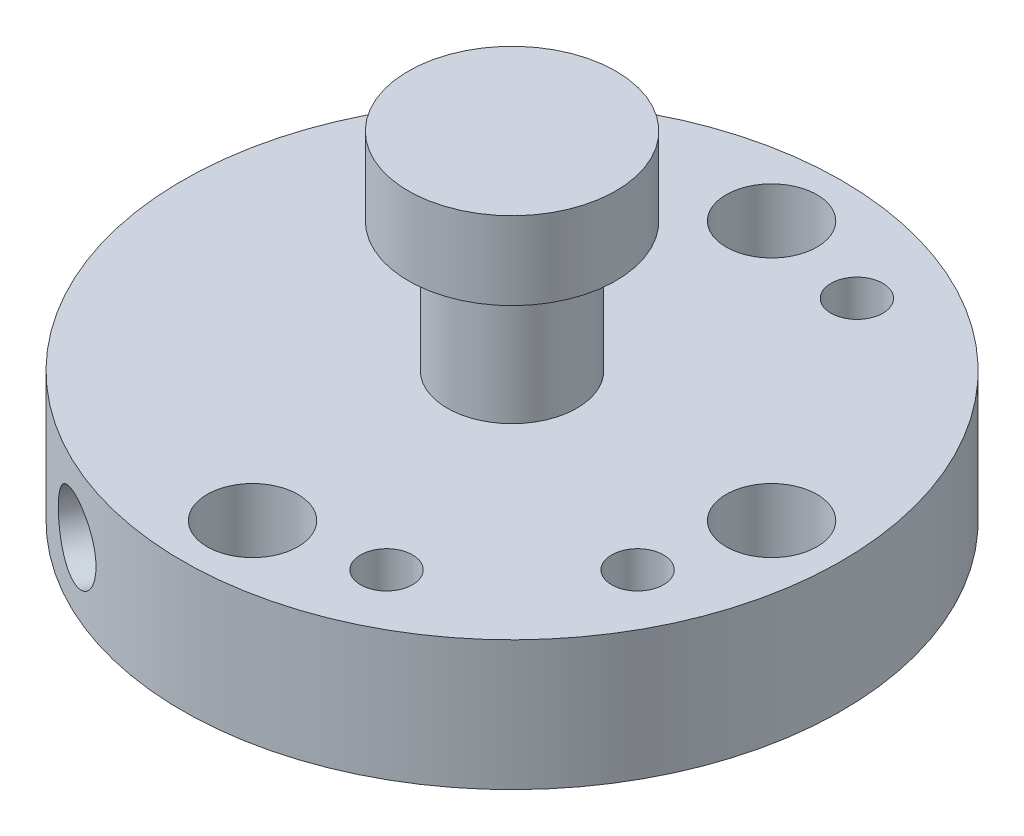
ISO-10303-21;
HEADER;
FILE_DESCRIPTION(('STEP AP214'),'2;1');
FILE_NAME('part.step','',(''),(''),'','','');
FILE_SCHEMA(('AUTOMOTIVE_DESIGN { 1 0 10303 214 1 1 1 1 }'));
ENDSEC;
DATA;
#1=APPLICATION_CONTEXT('core data for automotive mechanical design processes');
#2=APPLICATION_PROTOCOL_DEFINITION('international standard','automotive_design',2000,#1);
#3=PRODUCT_CONTEXT('',#1,'mechanical');
#4=PRODUCT('Part','Part','',(#3));
#5=PRODUCT_RELATED_PRODUCT_CATEGORY('part','',(#4));
#6=PRODUCT_DEFINITION_FORMATION('','',#4);
#7=PRODUCT_DEFINITION_CONTEXT('part definition',#1,'design');
#8=PRODUCT_DEFINITION('design','',#6,#7);
#9=PRODUCT_DEFINITION_SHAPE('','',#8);
#10=(LENGTH_UNIT() NAMED_UNIT(*) SI_UNIT(.MILLI.,.METRE.));
#11=(NAMED_UNIT(*) PLANE_ANGLE_UNIT() SI_UNIT($,.RADIAN.));
#12=(NAMED_UNIT(*) SI_UNIT($,.STERADIAN.) SOLID_ANGLE_UNIT());
#13=UNCERTAINTY_MEASURE_WITH_UNIT(LENGTH_MEASURE(1.E-05),#10,'distance_accuracy_value','');
#14=(GEOMETRIC_REPRESENTATION_CONTEXT(3) GLOBAL_UNCERTAINTY_ASSIGNED_CONTEXT((#13)) GLOBAL_UNIT_ASSIGNED_CONTEXT((#10,
#11,#12)) REPRESENTATION_CONTEXT('',''));
#15=CARTESIAN_POINT('',(0.,0.,0.));
#16=DIRECTION('',(0.,0.,1.));
#17=DIRECTION('',(1.,0.,0.));
#18=AXIS2_PLACEMENT_3D('',#15,#16,#17);
#19=CARTESIAN_POINT('',(0.,13.,0.));
#20=DIRECTION('',(0.,-1.,0.));
#21=DIRECTION('',(0.,0.,-1.));
#22=AXIS2_PLACEMENT_3D('',#19,#20,#21);
#23=PLANE('',#22);
#24=CARTESIAN_POINT('',(0.,13.,0.));
#25=DIRECTION('',(0.,-1.,0.));
#26=DIRECTION('',(0.,0.,-1.));
#27=AXIS2_PLACEMENT_3D('',#24,#25,#26);
#28=CIRCLE('',#27,4.);
#29=CARTESIAN_POINT('',(0.,13.,-4.));
#30=VERTEX_POINT('',#29);
#31=EDGE_CURVE('E20',#30,#30,#28,.T.);
#32=ORIENTED_EDGE('',*,*,#31,.F.);
#33=EDGE_LOOP('',(#32));
#34=FACE_BOUND('',#33,.T.);
#35=ADVANCED_FACE('F17',(#34),#23,.F.);
#36=CARTESIAN_POINT('',(0.,13.65,0.));
#37=DIRECTION('',(0.,-1.,0.));
#38=DIRECTION('',(0.,0.,-1.));
#39=AXIS2_PLACEMENT_3D('',#36,#37,#38);
#40=CYLINDRICAL_SURFACE('',#39,4.);
#41=ORIENTED_EDGE('',*,*,#31,.T.);
#42=EDGE_LOOP('',(#41));
#43=FACE_BOUND('',#42,.T.);
#44=CARTESIAN_POINT('',(0.,10.,0.));
#45=DIRECTION('',(0.,-1.,0.));
#46=DIRECTION('',(0.,0.,-1.));
#47=AXIS2_PLACEMENT_3D('',#44,#45,#46);
#48=CIRCLE('',#47,4.);
#49=CARTESIAN_POINT('',(0.,10.,-4.));
#50=VERTEX_POINT('',#49);
#51=EDGE_CURVE('E45',#50,#50,#48,.T.);
#52=ORIENTED_EDGE('',*,*,#51,.F.);
#53=EDGE_LOOP('',(#52));
#54=FACE_BOUND('',#53,.T.);
#55=ADVANCED_FACE('F163',(#43,#54),#40,.T.);
#56=CARTESIAN_POINT('',(0.,10.,0.));
#57=DIRECTION('',(0.,-1.,0.));
#58=DIRECTION('',(0.,0.,-1.));
#59=AXIS2_PLACEMENT_3D('',#56,#57,#58);
#60=PLANE('',#59);
#61=CARTESIAN_POINT('',(0.,10.,0.));
#62=DIRECTION('',(0.,-1.,0.));
#63=DIRECTION('',(0.,0.,-1.));
#64=AXIS2_PLACEMENT_3D('',#61,#62,#63);
#65=CIRCLE('',#64,2.5);
#66=CARTESIAN_POINT('',(0.,10.,-2.5));
#67=VERTEX_POINT('',#66);
#68=EDGE_CURVE('E39',#67,#67,#65,.T.);
#69=ORIENTED_EDGE('',*,*,#68,.F.);
#70=EDGE_LOOP('',(#69));
#71=FACE_BOUND('',#70,.T.);
#72=ORIENTED_EDGE('',*,*,#51,.T.);
#73=EDGE_LOOP('',(#72));
#74=FACE_BOUND('',#73,.T.);
#75=ADVANCED_FACE('F32',(#71,#74),#60,.T.);
#76=CARTESIAN_POINT('',(1.39464026375119,2.5,-2.99081569723573));
#77=DIRECTION('',(-0.422618261740681,0.,0.906307787036659));
#78=DIRECTION('',(0.906307787036659,0.,0.422618261740681));
#79=AXIS2_PLACEMENT_3D('',#76,#77,#78);
#80=CONICAL_SURFACE('',#79,1.49999999996027,1.02974425867617);
#81=CARTESIAN_POINT('',(1.77554226927218,2.5,-3.80766268411152));
#82=VERTEX_POINT('',#81);
#83=VERTEX_LOOP('',#82);
#84=FACE_BOUND('',#83,.T.);
#85=CARTESIAN_POINT('',(1.39464026374445,2.5,-2.99081569722086));
#86=DIRECTION('',(-0.422618261740681,0.,0.906307787036659));
#87=DIRECTION('',(0.906307787036659,0.,0.422618261740681));
#88=AXIS2_PLACEMENT_3D('',#85,#86,#87);
#89=CIRCLE('',#88,1.5);
#90=CARTESIAN_POINT('',(2.75410194429944,2.5,-2.35688830460984));
#91=VERTEX_POINT('',#90);
#92=EDGE_CURVE('E36',#91,#91,#89,.T.);
#93=ORIENTED_EDGE('',*,*,#92,.T.);
#94=EDGE_LOOP('',(#93));
#95=FACE_BOUND('',#94,.T.);
#96=ADVANCED_FACE('F28',(#84,#95),#80,.F.);
#97=CARTESIAN_POINT('',(0.,13.65,0.));
#98=DIRECTION('',(0.,-1.,0.));
#99=DIRECTION('',(0.,0.,-1.));
#100=AXIS2_PLACEMENT_3D('',#97,#98,#99);
#101=CYLINDRICAL_SURFACE('',#100,2.5);
#102=CARTESIAN_POINT('',(0.,5.,0.));
#103=DIRECTION('',(0.,-1.,0.));
#104=DIRECTION('',(0.,0.,-1.));
#105=AXIS2_PLACEMENT_3D('',#102,#103,#104);
#106=CIRCLE('',#105,2.5);
#107=CARTESIAN_POINT('',(0.,5.,-2.5));
#108=VERTEX_POINT('',#107);
#109=EDGE_CURVE('E38',#108,#108,#106,.F.);
#110=ORIENTED_EDGE('',*,*,#109,.T.);
#111=EDGE_LOOP('',(#110));
#112=FACE_BOUND('',#111,.T.);
#113=ORIENTED_EDGE('',*,*,#68,.T.);
#114=EDGE_LOOP('',(#113));
#115=FACE_BOUND('',#114,.T.);
#116=ADVANCED_FACE('F31',(#112,#115),#101,.T.);
#117=CARTESIAN_POINT('',(2.132681978957,2.5,-4.573551263119));
#118=DIRECTION('',(-0.422618261740681,0.,0.906307787036659));
#119=DIRECTION('',(0.906307787036659,0.,0.422618261740681));
#120=AXIS2_PLACEMENT_3D('',#117,#118,#119);
#121=CYLINDRICAL_SURFACE('',#120,1.5);
#122=ORIENTED_EDGE('',*,*,#92,.F.);
#123=EDGE_LOOP('',(#122));
#124=FACE_BOUND('',#123,.T.);
#125=CARTESIAN_POINT('',(-3.97022210722469,2.5,12.0634711596333));
#126=CARTESIAN_POINT('',(-3.97022591410956,2.41613626171538,12.0634706353555));
#127=CARTESIAN_POINT('',(-3.97698039922449,2.33216226442858,12.0612534087676));
#128=CARTESIAN_POINT('',(-4.00380477802316,2.16649075437455,12.0523748545496));
#129=CARTESIAN_POINT('',(-4.02390245169029,2.08479836236816,12.0457042550141));
#130=CARTESIAN_POINT('',(-4.07672904658194,1.92619883349531,12.0279279873252));
#131=CARTESIAN_POINT('',(-4.10944472146704,1.84928677624004,12.0168269697876));
#132=CARTESIAN_POINT('',(-4.18641841288593,1.70235359565551,11.9902273031278));
#133=CARTESIAN_POINT('',(-4.23067156532883,1.63232958548479,11.9747305069825));
#134=CARTESIAN_POINT('',(-4.32954524411073,1.50076350006435,11.9393383262271));
#135=CARTESIAN_POINT('',(-4.3842122156284,1.43926164100603,11.9194231677749));
#136=CARTESIAN_POINT('',(-4.50207932748534,1.32683140496281,11.8754044764067));
#137=CARTESIAN_POINT('',(-4.5652803034452,1.27590406463949,11.8513005332728));
#138=CARTESIAN_POINT('',(-4.69847461929875,1.18593318640807,11.7991295839346));
#139=CARTESIAN_POINT('',(-4.7684872840499,1.14692484038611,11.7710511932348));
#140=CARTESIAN_POINT('',(-4.9130221056574,1.08212507539745,11.7114609368353));
#141=CARTESIAN_POINT('',(-4.98754407279462,1.05633310081229,11.6799492155408));
#142=CARTESIAN_POINT('',(-5.13850945481263,1.01881471539259,11.614321327587));
#143=CARTESIAN_POINT('',(-5.21494225083705,1.00702307286824,11.5802180335715));
#144=CARTESIAN_POINT('',(-5.3678243553001,0.997638016082378,11.5101490263126));
#145=CARTESIAN_POINT('',(-5.44427366309744,1.00004412465891,11.4741833757));
#146=CARTESIAN_POINT('',(-5.5946285608187,1.0189337524339,11.4016256337488));
#147=CARTESIAN_POINT('',(-5.66854493674589,1.03534699357816,11.3650375619318));
#148=CARTESIAN_POINT('',(-5.81221466677056,1.08167548144747,11.2922385083987));
#149=CARTESIAN_POINT('',(-5.88196791192942,1.11159108131998,11.256027536571));
#150=CARTESIAN_POINT('',(-6.01564365365468,1.1841516870048,11.1851586865446));
#151=CARTESIAN_POINT('',(-6.07955142782724,1.22682773773099,11.150504835931));
#152=CARTESIAN_POINT('',(-6.19972307425843,1.32367153677186,11.0841397015269));
#153=CARTESIAN_POINT('',(-6.25598725543186,1.37783882044311,11.0524282988343));
#154=CARTESIAN_POINT('',(-6.3598046692036,1.49651067725114,10.9930200824681));
#155=CARTESIAN_POINT('',(-6.40730441457553,1.56107449350621,10.9653481215106));
#156=CARTESIAN_POINT('',(-6.49204082522322,1.69854109217163,10.9153943794378));
#157=CARTESIAN_POINT('',(-6.52927276941881,1.77144768882143,10.8931150784127));
#158=CARTESIAN_POINT('',(-6.59257420190124,1.92359982498908,10.8549223520492));
#159=CARTESIAN_POINT('',(-6.61863058036778,2.00285268059935,10.8390164045875));
#160=CARTESIAN_POINT('',(-6.65883529548752,2.16526948335083,10.8143643931199));
#161=CARTESIAN_POINT('',(-6.67300886854352,2.24842474373017,10.8056031564438));
#162=CARTESIAN_POINT('',(-6.6837755978639,2.36012111795231,10.7989419948239));
#163=CARTESIAN_POINT('',(-6.68578794235464,2.38804103788247,10.7976961514461));
#164=CARTESIAN_POINT('',(-6.68847335373301,2.44396986869392,10.7960329101938));
#165=CARTESIAN_POINT('',(-6.68914642014448,2.47197877960685,10.7956155126138));
#166=CARTESIAN_POINT('',(-6.68914261969618,2.58386373828462,10.7956189536551));
#167=CARTESIAN_POINT('',(-6.68310242624766,2.66783773557142,10.7993679836649));
#168=CARTESIAN_POINT('',(-6.65905868079672,2.83350924562545,10.8142096253405));
#169=CARTESIAN_POINT('',(-6.64103016947354,2.91520163763185,10.8253175578422));
#170=CARTESIAN_POINT('',(-6.59345647773279,3.07380116650469,10.854358712691));
#171=CARTESIAN_POINT('',(-6.56392337447644,3.15071322375996,10.8722847771115));
#172=CARTESIAN_POINT('',(-6.49406911252701,3.2976464043445,10.9141521095386));
#173=CARTESIAN_POINT('',(-6.45375249987384,3.36767041451521,10.9380908425059));
#174=CARTESIAN_POINT('',(-6.36308574083119,3.49923649993566,10.9910828194381));
#175=CARTESIAN_POINT('',(-6.31269059241439,3.56073835899398,11.0201589320934));
#176=CARTESIAN_POINT('',(-6.20320679940721,3.6731685950372,11.0821557087517));
#177=CARTESIAN_POINT('',(-6.14411730344512,3.72409593536051,11.1150767491944));
#178=CARTESIAN_POINT('',(-6.01853638170102,3.81406681359193,11.1835746748889));
#179=CARTESIAN_POINT('',(-5.95202381311057,3.85307515961389,11.2191590460277));
#180=CARTESIAN_POINT('',(-5.81346983583411,3.91787492460256,11.2915752644856));
#181=CARTESIAN_POINT('',(-5.7414286597181,3.94366689918771,11.3284070592934));
#182=CARTESIAN_POINT('',(-5.59411610378464,3.98118528460741,11.401868458065));
#183=CARTESIAN_POINT('',(-5.51886141065385,3.99297692713176,11.4384982018889));
#184=CARTESIAN_POINT('',(-5.36691471451665,4.00236198391762,11.5105731987761));
#185=CARTESIAN_POINT('',(-5.29022275990047,3.99995587534109,11.5460184916065));
#186=CARTESIAN_POINT('',(-5.13799403956259,3.9810662475661,11.6145578079885));
#187=CARTESIAN_POINT('',(-5.06245341986374,3.96465300642184,11.6476626777966));
#188=CARTESIAN_POINT('',(-4.91433698709356,3.91832451855253,11.7109257465185));
#189=CARTESIAN_POINT('',(-4.84176125162144,3.88840891868002,11.7410838683364));
#190=CARTESIAN_POINT('',(-4.70154745237186,3.8158483129952,11.7979318087551));
#191=CARTESIAN_POINT('',(-4.63392193727582,3.773172262269,11.8246129382297));
#192=CARTESIAN_POINT('',(-4.50583844948713,3.67632846322813,11.8740110740887));
#193=CARTESIAN_POINT('',(-4.4453801871435,3.62216117955689,11.8967282406866));
#194=CARTESIAN_POINT('',(-4.33313830587843,3.50348932274886,11.9380701282117));
#195=CARTESIAN_POINT('',(-4.28140810616835,3.43892550649379,11.9566698505642));
#196=CARTESIAN_POINT('',(-4.18867380478685,3.30145890782837,11.9894720606088));
#197=CARTESIAN_POINT('',(-4.14767463762655,3.22855231117857,12.003672525915));
#198=CARTESIAN_POINT('',(-4.07772793535311,3.07640017501091,12.027614425223));
#199=CARTESIAN_POINT('',(-4.04879455545592,2.99714731940065,12.0373506232064));
#200=CARTESIAN_POINT('',(-4.00406692632952,2.83473051664916,12.0523032142858));
#201=CARTESIAN_POINT('',(-3.98824483251358,2.75157525626982,12.0575291867836));
#202=CARTESIAN_POINT('',(-3.9762213664659,2.63987888204769,12.0614952677946));
#203=CARTESIAN_POINT('',(-3.97397348496426,2.61195896211753,12.0622360004225));
#204=CARTESIAN_POINT('',(-3.97097321908445,2.55603013130608,12.0632240340175));
#205=CARTESIAN_POINT('',(-3.97022083523798,2.52802122039315,12.0634713348092));
#206=CARTESIAN_POINT('',(-3.97022210722469,2.5,12.0634711596333));
#207=B_SPLINE_CURVE_WITH_KNOTS('',3,(#125,#126,#127,#128,#129,#130,#131,#132,#133,#134,#135,
#136,#137,#138,#139,#140,#141,#142,#143,#144,#145,#146,#147,#148,#149,#150,#151,#152,#153,#154,
#155,#156,#157,#158,#159,#160,#161,#162,#163,#164,#165,#166,#167,#168,#169,#170,#171,#172,#173,
#174,#175,#176,#177,#178,#179,#180,#181,#182,#183,#184,#185,#186,#187,#188,#189,#190,#191,#192,
#193,#194,#195,#196,#197,#198,#199,#200,#201,#202,#203,#204,#205,#206),.UNSPECIFIED.,.T.,.F.,(4,
2,2,2,2,2,2,2,2,2,2,2,2,2,2,2,2,2,2,2,2,2,2,2,2,2,2,2,2,2,2,2,2,2,2,2,2,2,2,2,4),(0.,
0.25148443810846,0.503494105525988,0.755239930912408,1.00687979379422,1.25966941096847,
1.51248379841286,1.76603758593995,2.01958071314891,2.271937813184,2.52428643198017,
2.77537633469056,3.02647280491301,3.2781852085814,3.52988743629811,3.78307830654183,
4.03638539923388,4.28998883375518,4.54305229742212,4.62708025162975,4.71110823571232,
4.96259267382079,5.21460234123832,5.46634816662474,5.71798802950654,5.97077764668079,
6.22359203412519,6.47714582165228,6.73068894886124,6.98304604889632,7.2353946676925,
7.48648457040289,7.73758104062534,7.98929344429372,8.24099567201043,8.49418654225415,
8.74749363494621,9.00109706946751,9.25416053313445,9.33818848734207,9.42221647142464),.UNSPECIFIED.);
#208=CARTESIAN_POINT('',(-3.97022210722469,2.5,12.0634711596333));
#209=VERTEX_POINT('',#208);
#210=EDGE_CURVE('E83',#209,#209,#207,.T.);
#211=ORIENTED_EDGE('',*,*,#210,.F.);
#212=EDGE_LOOP('',(#211));
#213=FACE_BOUND('',#212,.T.);
#214=ADVANCED_FACE('F90',(#124,#213),#121,.F.);
#215=CARTESIAN_POINT('',(0.,5.,0.));
#216=DIRECTION('',(0.,-1.,0.));
#217=DIRECTION('',(0.,0.,-1.));
#218=AXIS2_PLACEMENT_3D('',#215,#216,#217);
#219=PLANE('',#218);
#220=CARTESIAN_POINT('',(4.226182617407,5.,9.063077870366));
#221=DIRECTION('',(0.,1.,0.));
#222=DIRECTION('',(0.,0.,1.));
#223=AXIS2_PLACEMENT_3D('',#220,#221,#222);
#224=CIRCLE('',#223,1.);
#225=CARTESIAN_POINT('',(4.226182617407,5.,10.063077870366));
#226=VERTEX_POINT('',#225);
#227=EDGE_CURVE('E65',#226,#226,#224,.F.);
#228=ORIENTED_EDGE('',*,*,#227,.T.);
#229=EDGE_LOOP('',(#228));
#230=FACE_BOUND('',#229,.T.);
#231=CARTESIAN_POINT('',(9.063077870366,5.,4.226182617407));
#232=DIRECTION('',(0.,1.,0.));
#233=DIRECTION('',(0.,0.,1.));
#234=AXIS2_PLACEMENT_3D('',#231,#232,#233);
#235=CIRCLE('',#234,1.);
#236=CARTESIAN_POINT('',(9.063077870366,5.,5.226182617407));
#237=VERTEX_POINT('',#236);
#238=EDGE_CURVE('E68',#237,#237,#235,.F.);
#239=ORIENTED_EDGE('',*,*,#238,.T.);
#240=EDGE_LOOP('',(#239));
#241=FACE_BOUND('',#240,.T.);
#242=CARTESIAN_POINT('',(4.226182617407,5.,-9.063077870366));
#243=DIRECTION('',(0.,1.,0.));
#244=DIRECTION('',(0.,0.,1.));
#245=AXIS2_PLACEMENT_3D('',#242,#243,#244);
#246=CIRCLE('',#245,1.);
#247=CARTESIAN_POINT('',(4.226182617407,5.,-8.063077870366));
#248=VERTEX_POINT('',#247);
#249=EDGE_CURVE('E71',#248,#248,#246,.F.);
#250=ORIENTED_EDGE('',*,*,#249,.T.);
#251=EDGE_LOOP('',(#250));
#252=FACE_BOUND('',#251,.T.);
#253=CARTESIAN_POINT('',(-1.704987119415E-13,5.,10.));
#254=DIRECTION('',(0.,1.,0.));
#255=DIRECTION('',(0.,0.,1.));
#256=AXIS2_PLACEMENT_3D('',#253,#254,#255);
#257=CIRCLE('',#256,1.75);
#258=CARTESIAN_POINT('',(-1.704987119415E-13,5.,11.75));
#259=VERTEX_POINT('',#258);
#260=EDGE_CURVE('E74',#259,#259,#257,.F.);
#261=ORIENTED_EDGE('',*,*,#260,.T.);
#262=EDGE_LOOP('',(#261));
#263=FACE_BOUND('',#262,.T.);
#264=CARTESIAN_POINT('',(10.,5.,1.056926129637E-13));
#265=DIRECTION('',(0.,1.,0.));
#266=DIRECTION('',(0.,0.,1.));
#267=AXIS2_PLACEMENT_3D('',#264,#265,#266);
#268=CIRCLE('',#267,1.75);
#269=CARTESIAN_POINT('',(10.,5.,1.75000000000011));
#270=VERTEX_POINT('',#269);
#271=EDGE_CURVE('E77',#270,#270,#268,.F.);
#272=ORIENTED_EDGE('',*,*,#271,.T.);
#273=EDGE_LOOP('',(#272));
#274=FACE_BOUND('',#273,.T.);
#275=CARTESIAN_POINT('',(0.,5.,-10.));
#276=DIRECTION('',(0.,1.,0.));
#277=DIRECTION('',(0.,0.,1.));
#278=AXIS2_PLACEMENT_3D('',#275,#276,#277);
#279=CIRCLE('',#278,1.75);
#280=CARTESIAN_POINT('',(0.,5.,-8.25));
#281=VERTEX_POINT('',#280);
#282=EDGE_CURVE('E80',#281,#281,#279,.F.);
#283=ORIENTED_EDGE('',*,*,#282,.T.);
#284=EDGE_LOOP('',(#283));
#285=FACE_BOUND('',#284,.T.);
#286=ORIENTED_EDGE('',*,*,#109,.F.);
#287=EDGE_LOOP('',(#286));
#288=FACE_BOUND('',#287,.T.);
#289=CARTESIAN_POINT('',(0.,5.,0.));
#290=DIRECTION('',(0.,-1.,0.));
#291=DIRECTION('',(0.,0.,-1.));
#292=AXIS2_PLACEMENT_3D('',#289,#290,#291);
#293=CIRCLE('',#292,12.7);
#294=CARTESIAN_POINT('',(0.,5.,-12.7));
#295=VERTEX_POINT('',#294);
#296=EDGE_CURVE('E42',#295,#295,#293,.T.);
#297=ORIENTED_EDGE('',*,*,#296,.F.);
#298=EDGE_LOOP('',(#297));
#299=FACE_BOUND('',#298,.T.);
#300=ADVANCED_FACE('F99',(#230,#241,#252,#263,#274,#285,#288,#299),#219,.F.);
#301=CARTESIAN_POINT('',(0.,13.65,0.));
#302=DIRECTION('',(0.,-1.,0.));
#303=DIRECTION('',(0.,0.,-1.));
#304=AXIS2_PLACEMENT_3D('',#301,#302,#303);
#305=CYLINDRICAL_SURFACE('',#304,12.7);
#306=ORIENTED_EDGE('',*,*,#296,.T.);
#307=EDGE_LOOP('',(#306));
#308=FACE_BOUND('',#307,.T.);
#309=ORIENTED_EDGE('',*,*,#210,.T.);
#310=EDGE_LOOP('',(#309));
#311=FACE_BOUND('',#310,.T.);
#312=CARTESIAN_POINT('',(0.,-2.0643209364124E-13,0.));
#313=DIRECTION('',(0.,-1.,0.));
#314=DIRECTION('',(0.,0.,-1.));
#315=AXIS2_PLACEMENT_3D('',#312,#313,#314);
#316=CIRCLE('',#315,12.7);
#317=CARTESIAN_POINT('',(0.,-2.0643209364124E-13,-12.7));
#318=VERTEX_POINT('',#317);
#319=EDGE_CURVE('E62',#318,#318,#316,.T.);
#320=ORIENTED_EDGE('',*,*,#319,.F.);
#321=EDGE_LOOP('',(#320));
#322=FACE_BOUND('',#321,.T.);
#323=ADVANCED_FACE('F94',(#308,#311,#322),#305,.T.);
#324=CARTESIAN_POINT('',(0.,5.,-10.));
#325=DIRECTION('',(0.,1.,0.));
#326=DIRECTION('',(0.,0.,1.));
#327=AXIS2_PLACEMENT_3D('',#324,#325,#326);
#328=CYLINDRICAL_SURFACE('',#327,1.75);
#329=CARTESIAN_POINT('',(0.,-1.04083408558608E-13,-10.));
#330=DIRECTION('',(0.,1.,0.));
#331=DIRECTION('',(0.,0.,1.));
#332=AXIS2_PLACEMENT_3D('',#329,#330,#331);
#333=CIRCLE('',#332,1.75);
#334=CARTESIAN_POINT('',(0.,-1.04083408558608E-13,-8.25));
#335=VERTEX_POINT('',#334);
#336=EDGE_CURVE('E59',#335,#335,#333,.T.);
#337=ORIENTED_EDGE('',*,*,#336,.F.);
#338=EDGE_LOOP('',(#337));
#339=FACE_BOUND('',#338,.T.);
#340=ORIENTED_EDGE('',*,*,#282,.F.);
#341=EDGE_LOOP('',(#340));
#342=FACE_BOUND('',#341,.T.);
#343=ADVANCED_FACE('F98',(#339,#342),#328,.F.);
#344=CARTESIAN_POINT('',(10.,5.,1.056926129637E-13));
#345=DIRECTION('',(0.,1.,0.));
#346=DIRECTION('',(0.,0.,1.));
#347=AXIS2_PLACEMENT_3D('',#344,#345,#346);
#348=CYLINDRICAL_SURFACE('',#347,1.75);
#349=CARTESIAN_POINT('',(10.,-2.00360561475321E-13,1.056926129637E-13));
#350=DIRECTION('',(0.,1.,0.));
#351=DIRECTION('',(0.,0.,1.));
#352=AXIS2_PLACEMENT_3D('',#349,#350,#351);
#353=CIRCLE('',#352,1.75);
#354=CARTESIAN_POINT('',(10.,-2.00360561475321E-13,1.75000000000011));
#355=VERTEX_POINT('',#354);
#356=EDGE_CURVE('E56',#355,#355,#353,.T.);
#357=ORIENTED_EDGE('',*,*,#356,.F.);
#358=EDGE_LOOP('',(#357));
#359=FACE_BOUND('',#358,.T.);
#360=ORIENTED_EDGE('',*,*,#271,.F.);
#361=EDGE_LOOP('',(#360));
#362=FACE_BOUND('',#361,.T.);
#363=ADVANCED_FACE('F131',(#359,#362),#348,.F.);
#364=CARTESIAN_POINT('',(-1.704987119415E-13,5.,10.));
#365=DIRECTION('',(0.,1.,0.));
#366=DIRECTION('',(0.,0.,1.));
#367=AXIS2_PLACEMENT_3D('',#364,#365,#366);
#368=CYLINDRICAL_SURFACE('',#367,1.75);
#369=CARTESIAN_POINT('',(-1.704987119415E-13,-1.04083408558608E-13,10.));
#370=DIRECTION('',(0.,1.,0.));
#371=DIRECTION('',(0.,0.,1.));
#372=AXIS2_PLACEMENT_3D('',#369,#370,#371);
#373=CIRCLE('',#372,1.75);
#374=CARTESIAN_POINT('',(-1.704987119415E-13,-1.04083408558608E-13,11.75));
#375=VERTEX_POINT('',#374);
#376=EDGE_CURVE('E53',#375,#375,#373,.T.);
#377=ORIENTED_EDGE('',*,*,#376,.F.);
#378=EDGE_LOOP('',(#377));
#379=FACE_BOUND('',#378,.T.);
#380=ORIENTED_EDGE('',*,*,#260,.F.);
#381=EDGE_LOOP('',(#380));
#382=FACE_BOUND('',#381,.T.);
#383=ADVANCED_FACE('F128',(#379,#382),#368,.F.);
#384=CARTESIAN_POINT('',(4.226182617407,5.,-9.063077870366));
#385=DIRECTION('',(0.,1.,0.));
#386=DIRECTION('',(0.,0.,1.));
#387=AXIS2_PLACEMENT_3D('',#384,#385,#386);
#388=CYLINDRICAL_SURFACE('',#387,1.);
#389=CARTESIAN_POINT('',(4.226182617407,-1.38777878078145E-13,-9.063077870366));
#390=DIRECTION('',(0.,1.,0.));
#391=DIRECTION('',(0.,0.,1.));
#392=AXIS2_PLACEMENT_3D('',#389,#390,#391);
#393=CIRCLE('',#392,1.);
#394=CARTESIAN_POINT('',(4.226182617407,-1.38777878078145E-13,-8.063077870366));
#395=VERTEX_POINT('',#394);
#396=EDGE_CURVE('E50',#395,#395,#393,.T.);
#397=ORIENTED_EDGE('',*,*,#396,.F.);
#398=EDGE_LOOP('',(#397));
#399=FACE_BOUND('',#398,.T.);
#400=ORIENTED_EDGE('',*,*,#249,.F.);
#401=EDGE_LOOP('',(#400));
#402=FACE_BOUND('',#401,.T.);
#403=ADVANCED_FACE('F124',(#399,#402),#388,.F.);
#404=CARTESIAN_POINT('',(9.063077870366,5.,4.226182617407));
#405=DIRECTION('',(0.,1.,0.));
#406=DIRECTION('',(0.,0.,1.));
#407=AXIS2_PLACEMENT_3D('',#404,#405,#406);
#408=CYLINDRICAL_SURFACE('',#407,1.);
#409=CARTESIAN_POINT('',(9.063077870366,-1.77809156287623E-13,4.226182617407));
#410=DIRECTION('',(0.,1.,0.));
#411=DIRECTION('',(0.,0.,1.));
#412=AXIS2_PLACEMENT_3D('',#409,#410,#411);
#413=CIRCLE('',#412,1.);
#414=CARTESIAN_POINT('',(9.063077870366,-1.77809156287623E-13,5.226182617407));
#415=VERTEX_POINT('',#414);
#416=EDGE_CURVE('E24',#415,#415,#413,.T.);
#417=ORIENTED_EDGE('',*,*,#416,.F.);
#418=EDGE_LOOP('',(#417));
#419=FACE_BOUND('',#418,.T.);
#420=ORIENTED_EDGE('',*,*,#238,.F.);
#421=EDGE_LOOP('',(#420));
#422=FACE_BOUND('',#421,.T.);
#423=ADVANCED_FACE('F117',(#419,#422),#408,.F.);
#424=CARTESIAN_POINT('',(4.226182617407,5.,9.063077870366));
#425=DIRECTION('',(0.,1.,0.));
#426=DIRECTION('',(0.,0.,1.));
#427=AXIS2_PLACEMENT_3D('',#424,#425,#426);
#428=CYLINDRICAL_SURFACE('',#427,1.);
#429=CARTESIAN_POINT('',(4.226182617407,-1.38777878078145E-13,9.063077870366));
#430=DIRECTION('',(0.,1.,0.));
#431=DIRECTION('',(0.,0.,1.));
#432=AXIS2_PLACEMENT_3D('',#429,#430,#431);
#433=CIRCLE('',#432,1.);
#434=CARTESIAN_POINT('',(4.226182617407,-1.38777878078145E-13,10.063077870366));
#435=VERTEX_POINT('',#434);
#436=EDGE_CURVE('E11',#435,#435,#433,.T.);
#437=ORIENTED_EDGE('',*,*,#436,.F.);
#438=EDGE_LOOP('',(#437));
#439=FACE_BOUND('',#438,.T.);
#440=ORIENTED_EDGE('',*,*,#227,.F.);
#441=EDGE_LOOP('',(#440));
#442=FACE_BOUND('',#441,.T.);
#443=ADVANCED_FACE('F111',(#439,#442),#428,.F.);
#444=CARTESIAN_POINT('',(-1.063049363633E-13,-1.030286966852E-13,0.));
#445=DIRECTION('',(0.,-1.,0.));
#446=DIRECTION('',(0.,0.,-1.));
#447=AXIS2_PLACEMENT_3D('',#444,#445,#446);
#448=PLANE('',#447);
#449=ORIENTED_EDGE('',*,*,#436,.T.);
#450=EDGE_LOOP('',(#449));
#451=FACE_BOUND('',#450,.T.);
#452=ORIENTED_EDGE('',*,*,#416,.T.);
#453=EDGE_LOOP('',(#452));
#454=FACE_BOUND('',#453,.T.);
#455=ORIENTED_EDGE('',*,*,#396,.T.);
#456=EDGE_LOOP('',(#455));
#457=FACE_BOUND('',#456,.T.);
#458=ORIENTED_EDGE('',*,*,#376,.T.);
#459=EDGE_LOOP('',(#458));
#460=FACE_BOUND('',#459,.T.);
#461=ORIENTED_EDGE('',*,*,#356,.T.);
#462=EDGE_LOOP('',(#461));
#463=FACE_BOUND('',#462,.T.);
#464=ORIENTED_EDGE('',*,*,#336,.T.);
#465=EDGE_LOOP('',(#464));
#466=FACE_BOUND('',#465,.T.);
#467=ORIENTED_EDGE('',*,*,#319,.T.);
#468=EDGE_LOOP('',(#467));
#469=FACE_BOUND('',#468,.T.);
#470=ADVANCED_FACE('F109',(#451,#454,#457,#460,#463,#466,#469),#448,.T.);
#471=CLOSED_SHELL('',(#35,#55,#75,#96,#116,#214,#300,#323,#343,#363,#383,#403,#423,#443,#470));
#472=MANIFOLD_SOLID_BREP('B1',#471);
#473=ADVANCED_BREP_SHAPE_REPRESENTATION('',(#18,#472),#14);
#474=SHAPE_DEFINITION_REPRESENTATION(#9,#473);
ENDSEC;
END-ISO-10303-21;
